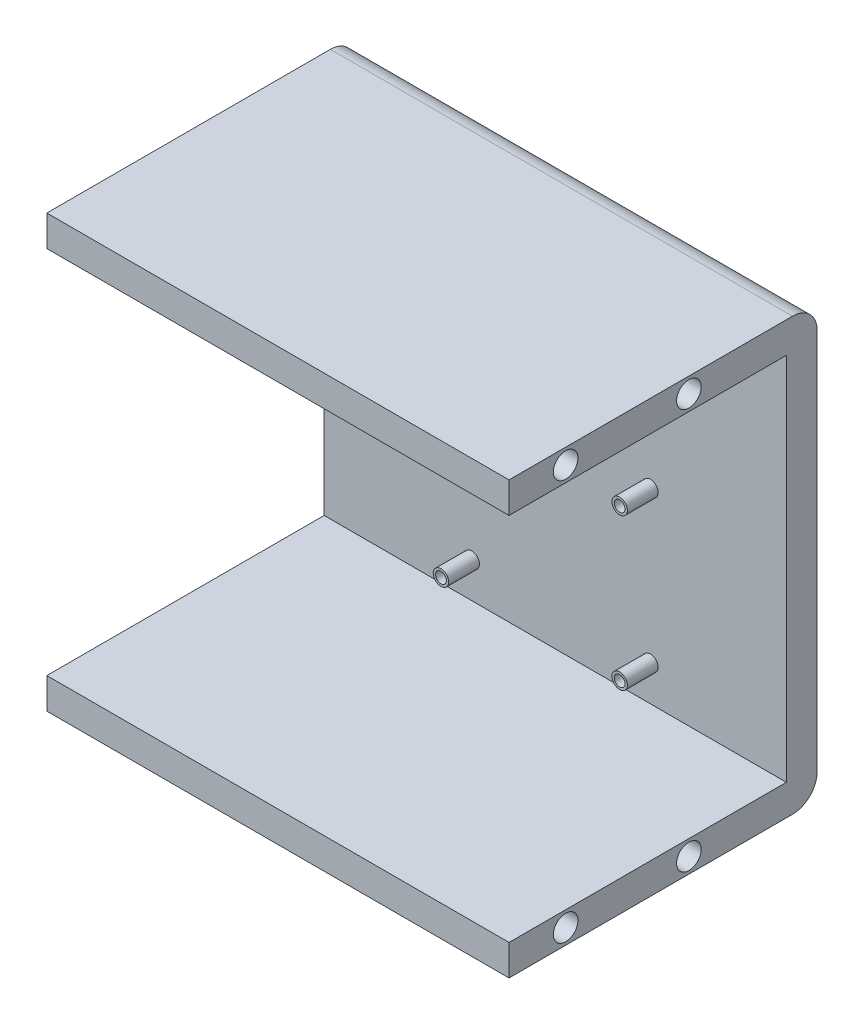
ISO-10303-21;
HEADER;
FILE_DESCRIPTION(('STEP AP214'),'2;1');
FILE_NAME('part.step','',(''),(''),'','','');
FILE_SCHEMA(('AUTOMOTIVE_DESIGN { 1 0 10303 214 1 1 1 1 }'));
ENDSEC;
DATA;
#1=APPLICATION_CONTEXT('core data for automotive mechanical design processes');
#2=APPLICATION_PROTOCOL_DEFINITION('international standard','automotive_design',2000,#1);
#3=PRODUCT_CONTEXT('',#1,'mechanical');
#4=PRODUCT('Part','Part','',(#3));
#5=PRODUCT_RELATED_PRODUCT_CATEGORY('part','',(#4));
#6=PRODUCT_DEFINITION_FORMATION('','',#4);
#7=PRODUCT_DEFINITION_CONTEXT('part definition',#1,'design');
#8=PRODUCT_DEFINITION('design','',#6,#7);
#9=PRODUCT_DEFINITION_SHAPE('','',#8);
#10=(LENGTH_UNIT() NAMED_UNIT(*) SI_UNIT(.MILLI.,.METRE.));
#11=(NAMED_UNIT(*) PLANE_ANGLE_UNIT() SI_UNIT($,.RADIAN.));
#12=(NAMED_UNIT(*) SI_UNIT($,.STERADIAN.) SOLID_ANGLE_UNIT());
#13=UNCERTAINTY_MEASURE_WITH_UNIT(LENGTH_MEASURE(1.E-05),#10,'distance_accuracy_value','');
#14=(GEOMETRIC_REPRESENTATION_CONTEXT(3) GLOBAL_UNCERTAINTY_ASSIGNED_CONTEXT((#13)) GLOBAL_UNIT_ASSIGNED_CONTEXT((#10,
#11,#12)) REPRESENTATION_CONTEXT('',''));
#15=CARTESIAN_POINT('',(0.,0.,0.));
#16=DIRECTION('',(0.,0.,1.));
#17=DIRECTION('',(1.,0.,0.));
#18=AXIS2_PLACEMENT_3D('',#15,#16,#17);
#19=CARTESIAN_POINT('',(150.,60.,10.));
#20=DIRECTION('',(-1.,0.,0.));
#21=DIRECTION('',(0.,0.,1.));
#22=AXIS2_PLACEMENT_3D('',#19,#20,#21);
#23=PLANE('',#22);
#24=CARTESIAN_POINT('',(150.,65.,41.6267321895131));
#25=DIRECTION('',(1.,0.,0.));
#26=DIRECTION('',(0.,0.,-1.));
#27=AXIS2_PLACEMENT_3D('',#24,#25,#26);
#28=CIRCLE('',#27,4.);
#29=CARTESIAN_POINT('',(150.,65.,37.6267321895131));
#30=VERTEX_POINT('',#29);
#31=EDGE_CURVE('E296',#30,#30,#28,.T.);
#32=ORIENTED_EDGE('',*,*,#31,.F.);
#33=EDGE_LOOP('',(#32));
#34=FACE_BOUND('',#33,.T.);
#35=CARTESIAN_POINT('',(150.,-65.,81.6267321895131));
#36=DIRECTION('',(1.,0.,0.));
#37=DIRECTION('',(0.,0.,-1.));
#38=AXIS2_PLACEMENT_3D('',#35,#36,#37);
#39=CIRCLE('',#38,4.00000000000001);
#40=CARTESIAN_POINT('',(150.,-65.,77.6267321895131));
#41=VERTEX_POINT('',#40);
#42=EDGE_CURVE('E289',#41,#41,#39,.T.);
#43=ORIENTED_EDGE('',*,*,#42,.F.);
#44=EDGE_LOOP('',(#43));
#45=FACE_BOUND('',#44,.T.);
#46=CARTESIAN_POINT('',(150.,-65.,41.6267321895131));
#47=DIRECTION('',(1.,0.,0.));
#48=DIRECTION('',(0.,0.,-1.));
#49=AXIS2_PLACEMENT_3D('',#46,#47,#48);
#50=CIRCLE('',#49,4.);
#51=CARTESIAN_POINT('',(150.,-65.,37.6267321895131));
#52=VERTEX_POINT('',#51);
#53=EDGE_CURVE('E301',#52,#52,#50,.T.);
#54=ORIENTED_EDGE('',*,*,#53,.F.);
#55=EDGE_LOOP('',(#54));
#56=FACE_BOUND('',#55,.T.);
#57=CARTESIAN_POINT('',(150.,65.,81.6267321895131));
#58=DIRECTION('',(1.,0.,0.));
#59=DIRECTION('',(0.,0.,-1.));
#60=AXIS2_PLACEMENT_3D('',#57,#58,#59);
#61=CIRCLE('',#60,4.00000000000001);
#62=CARTESIAN_POINT('',(150.,65.,77.6267321895131));
#63=VERTEX_POINT('',#62);
#64=EDGE_CURVE('E283',#63,#63,#61,.T.);
#65=ORIENTED_EDGE('',*,*,#64,.F.);
#66=EDGE_LOOP('',(#65));
#67=FACE_BOUND('',#66,.T.);
#68=DIRECTION('',(0.,1.,0.));
#69=VECTOR('',#68,1.);
#70=CARTESIAN_POINT('',(150.,60.,0.));
#71=LINE('',#70,#69);
#72=CARTESIAN_POINT('',(150.,-62.,0.));
#73=VERTEX_POINT('',#72);
#74=CARTESIAN_POINT('',(150.,62.,0.));
#75=VERTEX_POINT('',#74);
#76=EDGE_CURVE('E225',#73,#75,#71,.T.);
#77=ORIENTED_EDGE('',*,*,#76,.T.);
#78=CARTESIAN_POINT('',(150.,62.,8.));
#79=DIRECTION('',(-1.,0.,0.));
#80=DIRECTION('',(0.,0.,1.));
#81=AXIS2_PLACEMENT_3D('',#78,#79,#80);
#82=CIRCLE('',#81,8.);
#83=CARTESIAN_POINT('',(150.,70.,8.));
#84=VERTEX_POINT('',#83);
#85=EDGE_CURVE('E41',#75,#84,#82,.F.);
#86=ORIENTED_EDGE('',*,*,#85,.T.);
#87=DIRECTION('',(0.,0.,-1.));
#88=VECTOR('',#87,1.);
#89=CARTESIAN_POINT('',(150.,70.,0.));
#90=LINE('',#89,#88);
#91=CARTESIAN_POINT('',(150.,70.,100.));
#92=VERTEX_POINT('',#91);
#93=EDGE_CURVE('E131',#92,#84,#90,.T.);
#94=ORIENTED_EDGE('',*,*,#93,.F.);
#95=DIRECTION('',(0.,-1.,0.));
#96=VECTOR('',#95,1.);
#97=CARTESIAN_POINT('',(150.,70.,100.));
#98=LINE('',#97,#96);
#99=CARTESIAN_POINT('',(150.,60.,100.));
#100=VERTEX_POINT('',#99);
#101=EDGE_CURVE('E129',#92,#100,#98,.T.);
#102=ORIENTED_EDGE('',*,*,#101,.T.);
#103=DIRECTION('',(0.,0.,-1.));
#104=VECTOR('',#103,1.);
#105=CARTESIAN_POINT('',(150.,60.,0.));
#106=LINE('',#105,#104);
#107=CARTESIAN_POINT('',(150.,60.,10.));
#108=VERTEX_POINT('',#107);
#109=EDGE_CURVE('E122',#100,#108,#106,.T.);
#110=ORIENTED_EDGE('',*,*,#109,.T.);
#111=DIRECTION('',(0.,1.,0.));
#112=VECTOR('',#111,1.);
#113=CARTESIAN_POINT('',(150.,60.,10.));
#114=LINE('',#113,#112);
#115=CARTESIAN_POINT('',(150.,-60.,10.));
#116=VERTEX_POINT('',#115);
#117=EDGE_CURVE('E228',#116,#108,#114,.T.);
#118=ORIENTED_EDGE('',*,*,#117,.F.);
#119=DIRECTION('',(0.,0.,1.));
#120=VECTOR('',#119,1.);
#121=CARTESIAN_POINT('',(150.,-60.,0.));
#122=LINE('',#121,#120);
#123=CARTESIAN_POINT('',(150.,-60.,100.));
#124=VERTEX_POINT('',#123);
#125=EDGE_CURVE('E140',#116,#124,#122,.T.);
#126=ORIENTED_EDGE('',*,*,#125,.T.);
#127=DIRECTION('',(0.,1.,0.));
#128=VECTOR('',#127,1.);
#129=CARTESIAN_POINT('',(150.,-70.,100.));
#130=LINE('',#129,#128);
#131=CARTESIAN_POINT('',(150.,-70.,100.));
#132=VERTEX_POINT('',#131);
#133=EDGE_CURVE('E158',#132,#124,#130,.T.);
#134=ORIENTED_EDGE('',*,*,#133,.F.);
#135=DIRECTION('',(0.,0.,1.));
#136=VECTOR('',#135,1.);
#137=CARTESIAN_POINT('',(150.,-70.,0.));
#138=LINE('',#137,#136);
#139=CARTESIAN_POINT('',(150.,-70.,8.));
#140=VERTEX_POINT('',#139);
#141=EDGE_CURVE('E148',#140,#132,#138,.T.);
#142=ORIENTED_EDGE('',*,*,#141,.F.);
#143=CARTESIAN_POINT('',(150.,-62.,8.));
#144=DIRECTION('',(-1.,0.,0.));
#145=DIRECTION('',(0.,0.,1.));
#146=AXIS2_PLACEMENT_3D('',#143,#144,#145);
#147=CIRCLE('',#146,8.);
#148=EDGE_CURVE('E48',#140,#73,#147,.F.);
#149=ORIENTED_EDGE('',*,*,#148,.T.);
#150=EDGE_LOOP('',(#77,#86,#94,#102,#110,#118,#126,#134,#142,#149));
#151=FACE_BOUND('',#150,.T.);
#152=ADVANCED_FACE('F33',(#34,#45,#56,#67,#151),#23,.F.);
#153=CARTESIAN_POINT('',(0.,60.,10.));
#154=DIRECTION('',(1.,0.,0.));
#155=DIRECTION('',(0.,0.,-1.));
#156=AXIS2_PLACEMENT_3D('',#153,#154,#155);
#157=PLANE('',#156);
#158=CARTESIAN_POINT('',(0.,-30.,5.));
#159=DIRECTION('',(-1.,0.,0.));
#160=DIRECTION('',(0.,0.,1.));
#161=AXIS2_PLACEMENT_3D('',#158,#159,#160);
#162=CIRCLE('',#161,4.);
#163=CARTESIAN_POINT('',(0.,-30.,9.));
#164=VERTEX_POINT('',#163);
#165=EDGE_CURVE('E207',#164,#164,#162,.T.);
#166=ORIENTED_EDGE('',*,*,#165,.F.);
#167=EDGE_LOOP('',(#166));
#168=FACE_BOUND('',#167,.T.);
#169=CARTESIAN_POINT('',(0.,30.,5.00000000000001));
#170=DIRECTION('',(-1.,0.,0.));
#171=DIRECTION('',(0.,0.,1.));
#172=AXIS2_PLACEMENT_3D('',#169,#170,#171);
#173=CIRCLE('',#172,4.);
#174=CARTESIAN_POINT('',(0.,30.,9.00000000000001));
#175=VERTEX_POINT('',#174);
#176=EDGE_CURVE('E214',#175,#175,#173,.T.);
#177=ORIENTED_EDGE('',*,*,#176,.F.);
#178=EDGE_LOOP('',(#177));
#179=FACE_BOUND('',#178,.T.);
#180=CARTESIAN_POINT('',(0.,0.,5.00000000000001));
#181=DIRECTION('',(-1.,0.,0.));
#182=DIRECTION('',(0.,0.,1.));
#183=AXIS2_PLACEMENT_3D('',#180,#181,#182);
#184=CIRCLE('',#183,4.);
#185=CARTESIAN_POINT('',(0.,0.,9.00000000000001));
#186=VERTEX_POINT('',#185);
#187=EDGE_CURVE('E213',#186,#186,#184,.T.);
#188=ORIENTED_EDGE('',*,*,#187,.F.);
#189=EDGE_LOOP('',(#188));
#190=FACE_BOUND('',#189,.T.);
#191=DIRECTION('',(0.,0.,1.));
#192=VECTOR('',#191,1.);
#193=CARTESIAN_POINT('',(0.,70.,0.));
#194=LINE('',#193,#192);
#195=CARTESIAN_POINT('',(0.,70.,8.));
#196=VERTEX_POINT('',#195);
#197=CARTESIAN_POINT('',(0.,70.,100.));
#198=VERTEX_POINT('',#197);
#199=EDGE_CURVE('E112',#196,#198,#194,.T.);
#200=ORIENTED_EDGE('',*,*,#199,.F.);
#201=CARTESIAN_POINT('',(0.,62.,8.));
#202=DIRECTION('',(1.,0.,0.));
#203=DIRECTION('',(0.,0.,-1.));
#204=AXIS2_PLACEMENT_3D('',#201,#202,#203);
#205=CIRCLE('',#204,8.);
#206=CARTESIAN_POINT('',(0.,62.,0.));
#207=VERTEX_POINT('',#206);
#208=EDGE_CURVE('E247',#196,#207,#205,.F.);
#209=ORIENTED_EDGE('',*,*,#208,.T.);
#210=DIRECTION('',(0.,-1.,0.));
#211=VECTOR('',#210,1.);
#212=CARTESIAN_POINT('',(0.,60.,0.));
#213=LINE('',#212,#211);
#214=CARTESIAN_POINT('',(0.,-62.,0.));
#215=VERTEX_POINT('',#214);
#216=EDGE_CURVE('E232',#207,#215,#213,.T.);
#217=ORIENTED_EDGE('',*,*,#216,.T.);
#218=CARTESIAN_POINT('',(0.,-62.,8.));
#219=DIRECTION('',(1.,0.,0.));
#220=DIRECTION('',(0.,0.,-1.));
#221=AXIS2_PLACEMENT_3D('',#218,#219,#220);
#222=CIRCLE('',#221,8.);
#223=CARTESIAN_POINT('',(0.,-70.,8.));
#224=VERTEX_POINT('',#223);
#225=EDGE_CURVE('E245',#215,#224,#222,.F.);
#226=ORIENTED_EDGE('',*,*,#225,.T.);
#227=DIRECTION('',(0.,0.,-1.));
#228=VECTOR('',#227,1.);
#229=CARTESIAN_POINT('',(0.,-70.,0.));
#230=LINE('',#229,#228);
#231=CARTESIAN_POINT('',(0.,-70.,100.));
#232=VERTEX_POINT('',#231);
#233=EDGE_CURVE('E145',#232,#224,#230,.T.);
#234=ORIENTED_EDGE('',*,*,#233,.F.);
#235=DIRECTION('',(0.,1.,0.));
#236=VECTOR('',#235,1.);
#237=CARTESIAN_POINT('',(0.,-70.,100.));
#238=LINE('',#237,#236);
#239=CARTESIAN_POINT('',(0.,-60.,100.));
#240=VERTEX_POINT('',#239);
#241=EDGE_CURVE('E152',#232,#240,#238,.T.);
#242=ORIENTED_EDGE('',*,*,#241,.T.);
#243=DIRECTION('',(0.,0.,-1.));
#244=VECTOR('',#243,1.);
#245=CARTESIAN_POINT('',(0.,-60.,0.));
#246=LINE('',#245,#244);
#247=CARTESIAN_POINT('',(0.,-60.,10.));
#248=VERTEX_POINT('',#247);
#249=EDGE_CURVE('E137',#240,#248,#246,.T.);
#250=ORIENTED_EDGE('',*,*,#249,.T.);
#251=DIRECTION('',(0.,-1.,0.));
#252=VECTOR('',#251,1.);
#253=CARTESIAN_POINT('',(0.,60.,10.));
#254=LINE('',#253,#252);
#255=CARTESIAN_POINT('',(0.,60.,10.));
#256=VERTEX_POINT('',#255);
#257=EDGE_CURVE('E235',#256,#248,#254,.T.);
#258=ORIENTED_EDGE('',*,*,#257,.F.);
#259=DIRECTION('',(0.,0.,1.));
#260=VECTOR('',#259,1.);
#261=CARTESIAN_POINT('',(0.,60.,0.));
#262=LINE('',#261,#260);
#263=CARTESIAN_POINT('',(0.,60.,100.));
#264=VERTEX_POINT('',#263);
#265=EDGE_CURVE('E135',#256,#264,#262,.T.);
#266=ORIENTED_EDGE('',*,*,#265,.T.);
#267=DIRECTION('',(0.,-1.,0.));
#268=VECTOR('',#267,1.);
#269=CARTESIAN_POINT('',(0.,70.,100.));
#270=LINE('',#269,#268);
#271=EDGE_CURVE('E127',#198,#264,#270,.T.);
#272=ORIENTED_EDGE('',*,*,#271,.F.);
#273=EDGE_LOOP('',(#200,#209,#217,#226,#234,#242,#250,#258,#266,#272));
#274=FACE_BOUND('',#273,.T.);
#275=ADVANCED_FACE('F133',(#168,#179,#190,#274),#157,.F.);
#276=CARTESIAN_POINT('',(0.,0.,10.));
#277=DIRECTION('',(0.,0.,1.));
#278=DIRECTION('',(1.,0.,0.));
#279=AXIS2_PLACEMENT_3D('',#276,#277,#278);
#280=PLANE('',#279);
#281=CARTESIAN_POINT('',(47.9001152163457,-48.5,10.));
#282=DIRECTION('',(0.,0.,1.));
#283=DIRECTION('',(1.,0.,0.));
#284=AXIS2_PLACEMENT_3D('',#281,#282,#283);
#285=CIRCLE('',#284,2.50000000000001);
#286=CARTESIAN_POINT('',(50.4001152163457,-48.5,10.));
#287=VERTEX_POINT('',#286);
#288=EDGE_CURVE('E183',#287,#287,#285,.T.);
#289=ORIENTED_EDGE('',*,*,#288,.F.);
#290=EDGE_LOOP('',(#289));
#291=FACE_BOUND('',#290,.T.);
#292=CARTESIAN_POINT('',(105.9,-48.5,10.));
#293=DIRECTION('',(0.,0.,1.));
#294=DIRECTION('',(1.,0.,0.));
#295=AXIS2_PLACEMENT_3D('',#292,#293,#294);
#296=CIRCLE('',#295,2.5);
#297=CARTESIAN_POINT('',(108.4,-48.5,10.));
#298=VERTEX_POINT('',#297);
#299=EDGE_CURVE('E189',#298,#298,#296,.T.);
#300=ORIENTED_EDGE('',*,*,#299,.F.);
#301=EDGE_LOOP('',(#300));
#302=FACE_BOUND('',#301,.T.);
#303=CARTESIAN_POINT('',(105.9,0.615607451466016,10.));
#304=DIRECTION('',(0.,0.,1.));
#305=DIRECTION('',(1.,0.,0.));
#306=AXIS2_PLACEMENT_3D('',#303,#304,#305);
#307=CIRCLE('',#306,2.5);
#308=CARTESIAN_POINT('',(108.4,0.615607451466016,10.));
#309=VERTEX_POINT('',#308);
#310=EDGE_CURVE('E195',#309,#309,#307,.T.);
#311=ORIENTED_EDGE('',*,*,#310,.F.);
#312=EDGE_LOOP('',(#311));
#313=FACE_BOUND('',#312,.T.);
#314=CARTESIAN_POINT('',(47.9001152163457,0.499999999999987,10.));
#315=DIRECTION('',(0.,0.,1.));
#316=DIRECTION('',(1.,0.,0.));
#317=AXIS2_PLACEMENT_3D('',#314,#315,#316);
#318=CIRCLE('',#317,2.50000000000001);
#319=CARTESIAN_POINT('',(50.4001152163457,0.499999999999987,10.));
#320=VERTEX_POINT('',#319);
#321=EDGE_CURVE('E201',#320,#320,#318,.T.);
#322=ORIENTED_EDGE('',*,*,#321,.F.);
#323=EDGE_LOOP('',(#322));
#324=FACE_BOUND('',#323,.T.);
#325=ORIENTED_EDGE('',*,*,#117,.T.);
#326=DIRECTION('',(-1.,0.,0.));
#327=VECTOR('',#326,1.);
#328=CARTESIAN_POINT('',(0.,60.,10.));
#329=LINE('',#328,#327);
#330=EDGE_CURVE('E231',#108,#256,#329,.T.);
#331=ORIENTED_EDGE('',*,*,#330,.T.);
#332=ORIENTED_EDGE('',*,*,#257,.T.);
#333=DIRECTION('',(1.,0.,0.));
#334=VECTOR('',#333,1.);
#335=CARTESIAN_POINT('',(0.,-60.,10.));
#336=LINE('',#335,#334);
#337=EDGE_CURVE('E238',#248,#116,#336,.T.);
#338=ORIENTED_EDGE('',*,*,#337,.T.);
#339=EDGE_LOOP('',(#325,#331,#332,#338));
#340=FACE_BOUND('',#339,.T.);
#341=ADVANCED_FACE('F274',(#291,#302,#313,#324,#340),#280,.T.);
#342=CARTESIAN_POINT('',(0.,0.,0.));
#343=DIRECTION('',(0.,0.,1.));
#344=DIRECTION('',(1.,0.,0.));
#345=AXIS2_PLACEMENT_3D('',#342,#343,#344);
#346=PLANE('',#345);
#347=ORIENTED_EDGE('',*,*,#216,.F.);
#348=DIRECTION('',(-1.,0.,0.));
#349=VECTOR('',#348,1.);
#350=CARTESIAN_POINT('',(150.,62.,0.));
#351=LINE('',#350,#349);
#352=EDGE_CURVE('E55',#207,#75,#351,.F.);
#353=ORIENTED_EDGE('',*,*,#352,.T.);
#354=ORIENTED_EDGE('',*,*,#76,.F.);
#355=DIRECTION('',(1.,0.,0.));
#356=VECTOR('',#355,1.);
#357=CARTESIAN_POINT('',(0.,-62.,0.));
#358=LINE('',#357,#356);
#359=EDGE_CURVE('E249',#73,#215,#358,.F.);
#360=ORIENTED_EDGE('',*,*,#359,.T.);
#361=EDGE_LOOP('',(#347,#353,#354,#360));
#362=FACE_BOUND('',#361,.T.);
#363=ADVANCED_FACE('F258',(#362),#346,.F.);
#364=CARTESIAN_POINT('',(30.,0.,5.00000000000001));
#365=DIRECTION('',(-1.,0.,0.));
#366=DIRECTION('',(0.,0.,1.));
#367=AXIS2_PLACEMENT_3D('',#364,#365,#366);
#368=CYLINDRICAL_SURFACE('',#367,4.);
#369=CARTESIAN_POINT('',(30.,0.,5.00000000000001));
#370=DIRECTION('',(-1.,0.,0.));
#371=DIRECTION('',(0.,0.,1.));
#372=AXIS2_PLACEMENT_3D('',#369,#370,#371);
#373=CIRCLE('',#372,4.);
#374=CARTESIAN_POINT('',(30.,0.,9.00000000000001));
#375=VERTEX_POINT('',#374);
#376=EDGE_CURVE('E222',#375,#375,#373,.T.);
#377=ORIENTED_EDGE('',*,*,#376,.F.);
#378=EDGE_LOOP('',(#377));
#379=FACE_BOUND('',#378,.T.);
#380=ORIENTED_EDGE('',*,*,#187,.T.);
#381=EDGE_LOOP('',(#380));
#382=FACE_BOUND('',#381,.T.);
#383=ADVANCED_FACE('F430',(#379,#382),#368,.F.);
#384=CARTESIAN_POINT('',(30.,0.,5.00000000000001));
#385=DIRECTION('',(-1.,0.,0.));
#386=DIRECTION('',(0.,0.,1.));
#387=AXIS2_PLACEMENT_3D('',#384,#385,#386);
#388=PLANE('',#387);
#389=ORIENTED_EDGE('',*,*,#376,.T.);
#390=EDGE_LOOP('',(#389));
#391=FACE_BOUND('',#390,.T.);
#392=ADVANCED_FACE('F420',(#391),#388,.T.);
#393=CARTESIAN_POINT('',(30.,30.,5.00000000000001));
#394=DIRECTION('',(-1.,0.,0.));
#395=DIRECTION('',(0.,0.,1.));
#396=AXIS2_PLACEMENT_3D('',#393,#394,#395);
#397=CYLINDRICAL_SURFACE('',#396,4.);
#398=CARTESIAN_POINT('',(30.,30.,5.00000000000001));
#399=DIRECTION('',(-1.,0.,0.));
#400=DIRECTION('',(0.,0.,1.));
#401=AXIS2_PLACEMENT_3D('',#398,#399,#400);
#402=CIRCLE('',#401,4.);
#403=CARTESIAN_POINT('',(30.,30.,9.00000000000001));
#404=VERTEX_POINT('',#403);
#405=EDGE_CURVE('E210',#404,#404,#402,.T.);
#406=ORIENTED_EDGE('',*,*,#405,.F.);
#407=EDGE_LOOP('',(#406));
#408=FACE_BOUND('',#407,.T.);
#409=ORIENTED_EDGE('',*,*,#176,.T.);
#410=EDGE_LOOP('',(#409));
#411=FACE_BOUND('',#410,.T.);
#412=ADVANCED_FACE('F416',(#408,#411),#397,.F.);
#413=CARTESIAN_POINT('',(30.,30.,5.00000000000001));
#414=DIRECTION('',(-1.,0.,0.));
#415=DIRECTION('',(0.,0.,1.));
#416=AXIS2_PLACEMENT_3D('',#413,#414,#415);
#417=PLANE('',#416);
#418=ORIENTED_EDGE('',*,*,#405,.T.);
#419=EDGE_LOOP('',(#418));
#420=FACE_BOUND('',#419,.T.);
#421=ADVANCED_FACE('F412',(#420),#417,.T.);
#422=CARTESIAN_POINT('',(30.,-30.,5.));
#423=DIRECTION('',(-1.,0.,0.));
#424=DIRECTION('',(0.,0.,1.));
#425=AXIS2_PLACEMENT_3D('',#422,#423,#424);
#426=CYLINDRICAL_SURFACE('',#425,4.);
#427=CARTESIAN_POINT('',(30.,-30.,5.));
#428=DIRECTION('',(-1.,0.,0.));
#429=DIRECTION('',(0.,0.,1.));
#430=AXIS2_PLACEMENT_3D('',#427,#428,#429);
#431=CIRCLE('',#430,4.);
#432=CARTESIAN_POINT('',(30.,-30.,9.));
#433=VERTEX_POINT('',#432);
#434=EDGE_CURVE('E217',#433,#433,#431,.T.);
#435=ORIENTED_EDGE('',*,*,#434,.F.);
#436=EDGE_LOOP('',(#435));
#437=FACE_BOUND('',#436,.T.);
#438=ORIENTED_EDGE('',*,*,#165,.T.);
#439=EDGE_LOOP('',(#438));
#440=FACE_BOUND('',#439,.T.);
#441=ADVANCED_FACE('F415',(#437,#440),#426,.F.);
#442=CARTESIAN_POINT('',(30.,-30.,5.));
#443=DIRECTION('',(-1.,0.,0.));
#444=DIRECTION('',(0.,0.,1.));
#445=AXIS2_PLACEMENT_3D('',#442,#443,#444);
#446=PLANE('',#445);
#447=ORIENTED_EDGE('',*,*,#434,.T.);
#448=EDGE_LOOP('',(#447));
#449=FACE_BOUND('',#448,.T.);
#450=ADVANCED_FACE('F410',(#449),#446,.T.);
#451=CARTESIAN_POINT('',(47.9001152163457,0.499999999999987,20.));
#452=DIRECTION('',(0.,0.,-1.));
#453=DIRECTION('',(-1.,0.,0.));
#454=AXIS2_PLACEMENT_3D('',#451,#452,#453);
#455=CYLINDRICAL_SURFACE('',#454,2.50000000000001);
#456=CARTESIAN_POINT('',(47.9001152163457,0.499999999999987,20.));
#457=DIRECTION('',(0.,0.,1.));
#458=DIRECTION('',(1.,0.,0.));
#459=AXIS2_PLACEMENT_3D('',#456,#457,#458);
#460=CIRCLE('',#459,2.50000000000001);
#461=CARTESIAN_POINT('',(50.4001152163457,0.499999999999987,20.));
#462=VERTEX_POINT('',#461);
#463=EDGE_CURVE('E204',#462,#462,#460,.T.);
#464=ORIENTED_EDGE('',*,*,#463,.F.);
#465=EDGE_LOOP('',(#464));
#466=FACE_BOUND('',#465,.T.);
#467=ORIENTED_EDGE('',*,*,#321,.T.);
#468=EDGE_LOOP('',(#467));
#469=FACE_BOUND('',#468,.T.);
#470=ADVANCED_FACE('F406',(#466,#469),#455,.T.);
#471=CARTESIAN_POINT('',(47.9001152163457,0.499999999999987,20.));
#472=DIRECTION('',(0.,0.,1.));
#473=DIRECTION('',(1.,0.,0.));
#474=AXIS2_PLACEMENT_3D('',#471,#472,#473);
#475=PLANE('',#474);
#476=CARTESIAN_POINT('',(47.9001152163457,0.499999999999987,20.));
#477=DIRECTION('',(0.,0.,1.));
#478=DIRECTION('',(1.,0.,0.));
#479=AXIS2_PLACEMENT_3D('',#476,#477,#478);
#480=CIRCLE('',#479,1.75);
#481=CARTESIAN_POINT('',(49.6501152163457,0.499999999999987,20.));
#482=VERTEX_POINT('',#481);
#483=EDGE_CURVE('E165',#482,#482,#480,.T.);
#484=ORIENTED_EDGE('',*,*,#483,.F.);
#485=EDGE_LOOP('',(#484));
#486=FACE_BOUND('',#485,.T.);
#487=ORIENTED_EDGE('',*,*,#463,.T.);
#488=EDGE_LOOP('',(#487));
#489=FACE_BOUND('',#488,.T.);
#490=ADVANCED_FACE('F402',(#486,#489),#475,.T.);
#491=CARTESIAN_POINT('',(105.9,0.615607451466016,20.));
#492=DIRECTION('',(0.,0.,-1.));
#493=DIRECTION('',(-1.,0.,0.));
#494=AXIS2_PLACEMENT_3D('',#491,#492,#493);
#495=CYLINDRICAL_SURFACE('',#494,2.5);
#496=CARTESIAN_POINT('',(105.9,0.615607451466016,20.));
#497=DIRECTION('',(0.,0.,1.));
#498=DIRECTION('',(1.,0.,0.));
#499=AXIS2_PLACEMENT_3D('',#496,#497,#498);
#500=CIRCLE('',#499,2.5);
#501=CARTESIAN_POINT('',(108.4,0.615607451466016,20.));
#502=VERTEX_POINT('',#501);
#503=EDGE_CURVE('E198',#502,#502,#500,.T.);
#504=ORIENTED_EDGE('',*,*,#503,.F.);
#505=EDGE_LOOP('',(#504));
#506=FACE_BOUND('',#505,.T.);
#507=ORIENTED_EDGE('',*,*,#310,.T.);
#508=EDGE_LOOP('',(#507));
#509=FACE_BOUND('',#508,.T.);
#510=ADVANCED_FACE('F398',(#506,#509),#495,.T.);
#511=CARTESIAN_POINT('',(105.9,0.615607451466016,20.));
#512=DIRECTION('',(0.,0.,1.));
#513=DIRECTION('',(1.,0.,0.));
#514=AXIS2_PLACEMENT_3D('',#511,#512,#513);
#515=PLANE('',#514);
#516=CARTESIAN_POINT('',(105.9,0.615607451466016,20.));
#517=DIRECTION('',(0.,0.,1.));
#518=DIRECTION('',(1.,0.,0.));
#519=AXIS2_PLACEMENT_3D('',#516,#517,#518);
#520=CIRCLE('',#519,1.75);
#521=CARTESIAN_POINT('',(107.65,0.615607451466016,20.));
#522=VERTEX_POINT('',#521);
#523=EDGE_CURVE('E161',#522,#522,#520,.T.);
#524=ORIENTED_EDGE('',*,*,#523,.F.);
#525=EDGE_LOOP('',(#524));
#526=FACE_BOUND('',#525,.T.);
#527=ORIENTED_EDGE('',*,*,#503,.T.);
#528=EDGE_LOOP('',(#527));
#529=FACE_BOUND('',#528,.T.);
#530=ADVANCED_FACE('F394',(#526,#529),#515,.T.);
#531=CARTESIAN_POINT('',(105.9,-48.5,20.));
#532=DIRECTION('',(0.,0.,-1.));
#533=DIRECTION('',(-1.,0.,0.));
#534=AXIS2_PLACEMENT_3D('',#531,#532,#533);
#535=CYLINDRICAL_SURFACE('',#534,2.5);
#536=CARTESIAN_POINT('',(105.9,-48.5,20.));
#537=DIRECTION('',(0.,0.,1.));
#538=DIRECTION('',(1.,0.,0.));
#539=AXIS2_PLACEMENT_3D('',#536,#537,#538);
#540=CIRCLE('',#539,2.5);
#541=CARTESIAN_POINT('',(108.4,-48.5,20.));
#542=VERTEX_POINT('',#541);
#543=EDGE_CURVE('E192',#542,#542,#540,.T.);
#544=ORIENTED_EDGE('',*,*,#543,.F.);
#545=EDGE_LOOP('',(#544));
#546=FACE_BOUND('',#545,.T.);
#547=ORIENTED_EDGE('',*,*,#299,.T.);
#548=EDGE_LOOP('',(#547));
#549=FACE_BOUND('',#548,.T.);
#550=ADVANCED_FACE('F390',(#546,#549),#535,.T.);
#551=CARTESIAN_POINT('',(105.9,-48.5,20.));
#552=DIRECTION('',(0.,0.,1.));
#553=DIRECTION('',(1.,0.,0.));
#554=AXIS2_PLACEMENT_3D('',#551,#552,#553);
#555=PLANE('',#554);
#556=CARTESIAN_POINT('',(105.9,-48.5,20.));
#557=DIRECTION('',(0.,0.,1.));
#558=DIRECTION('',(1.,0.,0.));
#559=AXIS2_PLACEMENT_3D('',#556,#557,#558);
#560=CIRCLE('',#559,1.75);
#561=CARTESIAN_POINT('',(107.65,-48.5,20.));
#562=VERTEX_POINT('',#561);
#563=EDGE_CURVE('E172',#562,#562,#560,.T.);
#564=ORIENTED_EDGE('',*,*,#563,.F.);
#565=EDGE_LOOP('',(#564));
#566=FACE_BOUND('',#565,.T.);
#567=ORIENTED_EDGE('',*,*,#543,.T.);
#568=EDGE_LOOP('',(#567));
#569=FACE_BOUND('',#568,.T.);
#570=ADVANCED_FACE('F386',(#566,#569),#555,.T.);
#571=CARTESIAN_POINT('',(47.9001152163457,-48.5,20.));
#572=DIRECTION('',(0.,0.,-1.));
#573=DIRECTION('',(-1.,0.,0.));
#574=AXIS2_PLACEMENT_3D('',#571,#572,#573);
#575=CYLINDRICAL_SURFACE('',#574,2.50000000000001);
#576=CARTESIAN_POINT('',(47.9001152163457,-48.5,20.));
#577=DIRECTION('',(0.,0.,1.));
#578=DIRECTION('',(1.,0.,0.));
#579=AXIS2_PLACEMENT_3D('',#576,#577,#578);
#580=CIRCLE('',#579,2.50000000000001);
#581=CARTESIAN_POINT('',(50.4001152163457,-48.5,20.));
#582=VERTEX_POINT('',#581);
#583=EDGE_CURVE('E186',#582,#582,#580,.T.);
#584=ORIENTED_EDGE('',*,*,#583,.F.);
#585=EDGE_LOOP('',(#584));
#586=FACE_BOUND('',#585,.T.);
#587=ORIENTED_EDGE('',*,*,#288,.T.);
#588=EDGE_LOOP('',(#587));
#589=FACE_BOUND('',#588,.T.);
#590=ADVANCED_FACE('F382',(#586,#589),#575,.T.);
#591=CARTESIAN_POINT('',(47.9001152163457,-48.5,20.));
#592=DIRECTION('',(0.,0.,1.));
#593=DIRECTION('',(1.,0.,0.));
#594=AXIS2_PLACEMENT_3D('',#591,#592,#593);
#595=PLANE('',#594);
#596=CARTESIAN_POINT('',(47.9001152163457,-48.5,20.));
#597=DIRECTION('',(0.,0.,1.));
#598=DIRECTION('',(1.,0.,0.));
#599=AXIS2_PLACEMENT_3D('',#596,#597,#598);
#600=CIRCLE('',#599,1.75);
#601=CARTESIAN_POINT('',(49.6501152163457,-48.5,20.));
#602=VERTEX_POINT('',#601);
#603=EDGE_CURVE('E166',#602,#602,#600,.T.);
#604=ORIENTED_EDGE('',*,*,#603,.F.);
#605=EDGE_LOOP('',(#604));
#606=FACE_BOUND('',#605,.T.);
#607=ORIENTED_EDGE('',*,*,#583,.T.);
#608=EDGE_LOOP('',(#607));
#609=FACE_BOUND('',#608,.T.);
#610=ADVANCED_FACE('F356',(#606,#609),#595,.T.);
#611=CARTESIAN_POINT('',(47.9001152163457,-48.5,11.));
#612=DIRECTION('',(0.,0.,1.));
#613=DIRECTION('',(1.,0.,0.));
#614=AXIS2_PLACEMENT_3D('',#611,#612,#613);
#615=CYLINDRICAL_SURFACE('',#614,1.75);
#616=CARTESIAN_POINT('',(47.9001152163457,-48.5,11.));
#617=DIRECTION('',(0.,0.,1.));
#618=DIRECTION('',(1.,0.,0.));
#619=AXIS2_PLACEMENT_3D('',#616,#617,#618);
#620=CIRCLE('',#619,1.75);
#621=CARTESIAN_POINT('',(49.6501152163457,-48.5,11.));
#622=VERTEX_POINT('',#621);
#623=EDGE_CURVE('E162',#622,#622,#620,.T.);
#624=ORIENTED_EDGE('',*,*,#623,.F.);
#625=EDGE_LOOP('',(#624));
#626=FACE_BOUND('',#625,.T.);
#627=ORIENTED_EDGE('',*,*,#603,.T.);
#628=EDGE_LOOP('',(#627));
#629=FACE_BOUND('',#628,.T.);
#630=ADVANCED_FACE('F352',(#626,#629),#615,.F.);
#631=CARTESIAN_POINT('',(47.9001152163457,-48.5,11.));
#632=DIRECTION('',(0.,0.,1.));
#633=DIRECTION('',(1.,0.,0.));
#634=AXIS2_PLACEMENT_3D('',#631,#632,#633);
#635=PLANE('',#634);
#636=ORIENTED_EDGE('',*,*,#623,.T.);
#637=EDGE_LOOP('',(#636));
#638=FACE_BOUND('',#637,.T.);
#639=ADVANCED_FACE('F348',(#638),#635,.T.);
#640=CARTESIAN_POINT('',(105.9,-48.5,11.));
#641=DIRECTION('',(0.,0.,1.));
#642=DIRECTION('',(1.,0.,0.));
#643=AXIS2_PLACEMENT_3D('',#640,#641,#642);
#644=CYLINDRICAL_SURFACE('',#643,1.75);
#645=CARTESIAN_POINT('',(105.9,-48.5,11.));
#646=DIRECTION('',(0.,0.,1.));
#647=DIRECTION('',(1.,0.,0.));
#648=AXIS2_PLACEMENT_3D('',#645,#646,#647);
#649=CIRCLE('',#648,1.75);
#650=CARTESIAN_POINT('',(107.65,-48.5,11.));
#651=VERTEX_POINT('',#650);
#652=EDGE_CURVE('E169',#651,#651,#649,.T.);
#653=ORIENTED_EDGE('',*,*,#652,.F.);
#654=EDGE_LOOP('',(#653));
#655=FACE_BOUND('',#654,.T.);
#656=ORIENTED_EDGE('',*,*,#563,.T.);
#657=EDGE_LOOP('',(#656));
#658=FACE_BOUND('',#657,.T.);
#659=ADVANCED_FACE('F351',(#655,#658),#644,.F.);
#660=CARTESIAN_POINT('',(105.9,-48.5,11.));
#661=DIRECTION('',(0.,0.,1.));
#662=DIRECTION('',(1.,0.,0.));
#663=AXIS2_PLACEMENT_3D('',#660,#661,#662);
#664=PLANE('',#663);
#665=ORIENTED_EDGE('',*,*,#652,.T.);
#666=EDGE_LOOP('',(#665));
#667=FACE_BOUND('',#666,.T.);
#668=ADVANCED_FACE('F358',(#667),#664,.T.);
#669=CARTESIAN_POINT('',(105.9,0.615607451466016,11.));
#670=DIRECTION('',(0.,0.,1.));
#671=DIRECTION('',(1.,0.,0.));
#672=AXIS2_PLACEMENT_3D('',#669,#670,#671);
#673=CYLINDRICAL_SURFACE('',#672,1.75);
#674=CARTESIAN_POINT('',(105.9,0.615607451466016,11.));
#675=DIRECTION('',(0.,0.,1.));
#676=DIRECTION('',(1.,0.,0.));
#677=AXIS2_PLACEMENT_3D('',#674,#675,#676);
#678=CIRCLE('',#677,1.75);
#679=CARTESIAN_POINT('',(107.65,0.615607451466016,11.));
#680=VERTEX_POINT('',#679);
#681=EDGE_CURVE('E175',#680,#680,#678,.T.);
#682=ORIENTED_EDGE('',*,*,#681,.F.);
#683=EDGE_LOOP('',(#682));
#684=FACE_BOUND('',#683,.T.);
#685=ORIENTED_EDGE('',*,*,#523,.T.);
#686=EDGE_LOOP('',(#685));
#687=FACE_BOUND('',#686,.T.);
#688=ADVANCED_FACE('F361',(#684,#687),#673,.F.);
#689=CARTESIAN_POINT('',(105.9,0.615607451466016,11.));
#690=DIRECTION('',(0.,0.,1.));
#691=DIRECTION('',(1.,0.,0.));
#692=AXIS2_PLACEMENT_3D('',#689,#690,#691);
#693=PLANE('',#692);
#694=ORIENTED_EDGE('',*,*,#681,.T.);
#695=EDGE_LOOP('',(#694));
#696=FACE_BOUND('',#695,.T.);
#697=ADVANCED_FACE('F366',(#696),#693,.T.);
#698=CARTESIAN_POINT('',(47.9001152163457,0.499999999999987,11.));
#699=DIRECTION('',(0.,0.,1.));
#700=DIRECTION('',(1.,0.,0.));
#701=AXIS2_PLACEMENT_3D('',#698,#699,#700);
#702=CYLINDRICAL_SURFACE('',#701,1.75);
#703=CARTESIAN_POINT('',(47.9001152163457,0.499999999999987,11.));
#704=DIRECTION('',(0.,0.,1.));
#705=DIRECTION('',(1.,0.,0.));
#706=AXIS2_PLACEMENT_3D('',#703,#704,#705);
#707=CIRCLE('',#706,1.75);
#708=CARTESIAN_POINT('',(49.6501152163457,0.499999999999987,11.));
#709=VERTEX_POINT('',#708);
#710=EDGE_CURVE('E180',#709,#709,#707,.T.);
#711=ORIENTED_EDGE('',*,*,#710,.F.);
#712=EDGE_LOOP('',(#711));
#713=FACE_BOUND('',#712,.T.);
#714=ORIENTED_EDGE('',*,*,#483,.T.);
#715=EDGE_LOOP('',(#714));
#716=FACE_BOUND('',#715,.T.);
#717=ADVANCED_FACE('F369',(#713,#716),#702,.F.);
#718=CARTESIAN_POINT('',(47.9001152163457,0.499999999999987,11.));
#719=DIRECTION('',(0.,0.,1.));
#720=DIRECTION('',(1.,0.,0.));
#721=AXIS2_PLACEMENT_3D('',#718,#719,#720);
#722=PLANE('',#721);
#723=ORIENTED_EDGE('',*,*,#710,.T.);
#724=EDGE_LOOP('',(#723));
#725=FACE_BOUND('',#724,.T.);
#726=ADVANCED_FACE('F345',(#725),#722,.T.);
#727=CARTESIAN_POINT('',(0.,-60.,0.));
#728=DIRECTION('',(0.,1.,0.));
#729=DIRECTION('',(-1.,0.,0.));
#730=AXIS2_PLACEMENT_3D('',#727,#728,#729);
#731=PLANE('',#730);
#732=ORIENTED_EDGE('',*,*,#337,.F.);
#733=ORIENTED_EDGE('',*,*,#249,.F.);
#734=DIRECTION('',(-1.,0.,0.));
#735=VECTOR('',#734,1.);
#736=CARTESIAN_POINT('',(0.,-60.,100.));
#737=LINE('',#736,#735);
#738=EDGE_CURVE('E149',#124,#240,#737,.T.);
#739=ORIENTED_EDGE('',*,*,#738,.F.);
#740=ORIENTED_EDGE('',*,*,#125,.F.);
#741=EDGE_LOOP('',(#732,#733,#739,#740));
#742=FACE_BOUND('',#741,.T.);
#743=ADVANCED_FACE('F271',(#742),#731,.T.);
#744=CARTESIAN_POINT('',(0.,-70.,100.));
#745=DIRECTION('',(0.,0.,-1.));
#746=DIRECTION('',(-1.,0.,0.));
#747=AXIS2_PLACEMENT_3D('',#744,#745,#746);
#748=PLANE('',#747);
#749=ORIENTED_EDGE('',*,*,#738,.T.);
#750=ORIENTED_EDGE('',*,*,#241,.F.);
#751=DIRECTION('',(-1.,0.,0.));
#752=VECTOR('',#751,1.);
#753=CARTESIAN_POINT('',(0.,-70.,100.));
#754=LINE('',#753,#752);
#755=EDGE_CURVE('E151',#132,#232,#754,.T.);
#756=ORIENTED_EDGE('',*,*,#755,.F.);
#757=ORIENTED_EDGE('',*,*,#133,.T.);
#758=EDGE_LOOP('',(#749,#750,#756,#757));
#759=FACE_BOUND('',#758,.T.);
#760=ADVANCED_FACE('F267',(#759),#748,.F.);
#761=CARTESIAN_POINT('',(0.,-70.,0.));
#762=DIRECTION('',(0.,1.,0.));
#763=DIRECTION('',(-1.,0.,0.));
#764=AXIS2_PLACEMENT_3D('',#761,#762,#763);
#765=PLANE('',#764);
#766=ORIENTED_EDGE('',*,*,#233,.T.);
#767=DIRECTION('',(1.,0.,0.));
#768=VECTOR('',#767,1.);
#769=CARTESIAN_POINT('',(0.,-70.,8.));
#770=LINE('',#769,#768);
#771=EDGE_CURVE('E11',#224,#140,#770,.T.);
#772=ORIENTED_EDGE('',*,*,#771,.T.);
#773=ORIENTED_EDGE('',*,*,#141,.T.);
#774=ORIENTED_EDGE('',*,*,#755,.T.);
#775=EDGE_LOOP('',(#766,#772,#773,#774));
#776=FACE_BOUND('',#775,.T.);
#777=ADVANCED_FACE('F261',(#776),#765,.F.);
#778=CARTESIAN_POINT('',(0.,70.,100.));
#779=DIRECTION('',(0.,0.,-1.));
#780=DIRECTION('',(-1.,0.,0.));
#781=AXIS2_PLACEMENT_3D('',#778,#779,#780);
#782=PLANE('',#781);
#783=DIRECTION('',(1.,0.,0.));
#784=VECTOR('',#783,1.);
#785=CARTESIAN_POINT('',(0.,60.,100.));
#786=LINE('',#785,#784);
#787=EDGE_CURVE('E278',#264,#100,#786,.T.);
#788=ORIENTED_EDGE('',*,*,#787,.T.);
#789=ORIENTED_EDGE('',*,*,#101,.F.);
#790=DIRECTION('',(1.,0.,0.));
#791=VECTOR('',#790,1.);
#792=CARTESIAN_POINT('',(0.,70.,100.));
#793=LINE('',#792,#791);
#794=EDGE_CURVE('E116',#198,#92,#793,.T.);
#795=ORIENTED_EDGE('',*,*,#794,.F.);
#796=ORIENTED_EDGE('',*,*,#271,.T.);
#797=EDGE_LOOP('',(#788,#789,#795,#796));
#798=FACE_BOUND('',#797,.T.);
#799=ADVANCED_FACE('F126',(#798),#782,.F.);
#800=CARTESIAN_POINT('',(0.,70.,0.));
#801=DIRECTION('',(0.,1.,0.));
#802=DIRECTION('',(-1.,0.,0.));
#803=AXIS2_PLACEMENT_3D('',#800,#801,#802);
#804=PLANE('',#803);
#805=ORIENTED_EDGE('',*,*,#93,.T.);
#806=DIRECTION('',(-1.,0.,0.));
#807=VECTOR('',#806,1.);
#808=CARTESIAN_POINT('',(0.,70.,8.));
#809=LINE('',#808,#807);
#810=EDGE_CURVE('E119',#84,#196,#809,.T.);
#811=ORIENTED_EDGE('',*,*,#810,.T.);
#812=ORIENTED_EDGE('',*,*,#199,.T.);
#813=ORIENTED_EDGE('',*,*,#794,.T.);
#814=EDGE_LOOP('',(#805,#811,#812,#813));
#815=FACE_BOUND('',#814,.T.);
#816=ADVANCED_FACE('F115',(#815),#804,.T.);
#817=CARTESIAN_POINT('',(0.,60.,0.));
#818=DIRECTION('',(0.,1.,0.));
#819=DIRECTION('',(-1.,0.,0.));
#820=AXIS2_PLACEMENT_3D('',#817,#818,#819);
#821=PLANE('',#820);
#822=ORIENTED_EDGE('',*,*,#330,.F.);
#823=ORIENTED_EDGE('',*,*,#109,.F.);
#824=ORIENTED_EDGE('',*,*,#787,.F.);
#825=ORIENTED_EDGE('',*,*,#265,.F.);
#826=EDGE_LOOP('',(#822,#823,#824,#825));
#827=FACE_BOUND('',#826,.T.);
#828=ADVANCED_FACE('F324',(#827),#821,.F.);
#829=CARTESIAN_POINT('',(120.,65.,81.6267321895131));
#830=DIRECTION('',(1.,0.,0.));
#831=DIRECTION('',(0.,0.,-1.));
#832=AXIS2_PLACEMENT_3D('',#829,#830,#831);
#833=CYLINDRICAL_SURFACE('',#832,4.00000000000001);
#834=CARTESIAN_POINT('',(120.,65.,81.6267321895131));
#835=DIRECTION('',(1.,0.,0.));
#836=DIRECTION('',(0.,0.,-1.));
#837=AXIS2_PLACEMENT_3D('',#834,#835,#836);
#838=CIRCLE('',#837,4.00000000000001);
#839=CARTESIAN_POINT('',(120.,65.,77.6267321895131));
#840=VERTEX_POINT('',#839);
#841=EDGE_CURVE('E281',#840,#840,#838,.T.);
#842=ORIENTED_EDGE('',*,*,#841,.F.);
#843=EDGE_LOOP('',(#842));
#844=FACE_BOUND('',#843,.T.);
#845=ORIENTED_EDGE('',*,*,#64,.T.);
#846=EDGE_LOOP('',(#845));
#847=FACE_BOUND('',#846,.T.);
#848=ADVANCED_FACE('F322',(#844,#847),#833,.F.);
#849=CARTESIAN_POINT('',(120.,65.,81.6267321895131));
#850=DIRECTION('',(1.,0.,0.));
#851=DIRECTION('',(0.,0.,-1.));
#852=AXIS2_PLACEMENT_3D('',#849,#850,#851);
#853=PLANE('',#852);
#854=ORIENTED_EDGE('',*,*,#841,.T.);
#855=EDGE_LOOP('',(#854));
#856=FACE_BOUND('',#855,.T.);
#857=ADVANCED_FACE('F312',(#856),#853,.T.);
#858=CARTESIAN_POINT('',(120.,-65.,41.6267321895131));
#859=DIRECTION('',(1.,0.,0.));
#860=DIRECTION('',(0.,0.,-1.));
#861=AXIS2_PLACEMENT_3D('',#858,#859,#860);
#862=CYLINDRICAL_SURFACE('',#861,4.);
#863=CARTESIAN_POINT('',(120.,-65.,41.6267321895131));
#864=DIRECTION('',(1.,0.,0.));
#865=DIRECTION('',(0.,0.,-1.));
#866=AXIS2_PLACEMENT_3D('',#863,#864,#865);
#867=CIRCLE('',#866,4.);
#868=CARTESIAN_POINT('',(120.,-65.,37.6267321895131));
#869=VERTEX_POINT('',#868);
#870=EDGE_CURVE('E293',#869,#869,#867,.T.);
#871=ORIENTED_EDGE('',*,*,#870,.F.);
#872=EDGE_LOOP('',(#871));
#873=FACE_BOUND('',#872,.T.);
#874=ORIENTED_EDGE('',*,*,#53,.T.);
#875=EDGE_LOOP('',(#874));
#876=FACE_BOUND('',#875,.T.);
#877=ADVANCED_FACE('F309',(#873,#876),#862,.F.);
#878=CARTESIAN_POINT('',(120.,-65.,41.6267321895131));
#879=DIRECTION('',(1.,0.,0.));
#880=DIRECTION('',(0.,0.,-1.));
#881=AXIS2_PLACEMENT_3D('',#878,#879,#880);
#882=PLANE('',#881);
#883=ORIENTED_EDGE('',*,*,#870,.T.);
#884=EDGE_LOOP('',(#883));
#885=FACE_BOUND('',#884,.T.);
#886=ADVANCED_FACE('F307',(#885),#882,.T.);
#887=CARTESIAN_POINT('',(120.,-65.,81.6267321895131));
#888=DIRECTION('',(1.,0.,0.));
#889=DIRECTION('',(0.,0.,-1.));
#890=AXIS2_PLACEMENT_3D('',#887,#888,#889);
#891=CYLINDRICAL_SURFACE('',#890,4.00000000000001);
#892=CARTESIAN_POINT('',(120.,-65.,81.6267321895131));
#893=DIRECTION('',(1.,0.,0.));
#894=DIRECTION('',(0.,0.,-1.));
#895=AXIS2_PLACEMENT_3D('',#892,#893,#894);
#896=CIRCLE('',#895,4.00000000000001);
#897=CARTESIAN_POINT('',(120.,-65.,77.6267321895131));
#898=VERTEX_POINT('',#897);
#899=EDGE_CURVE('E292',#898,#898,#896,.T.);
#900=ORIENTED_EDGE('',*,*,#899,.F.);
#901=EDGE_LOOP('',(#900));
#902=FACE_BOUND('',#901,.T.);
#903=ORIENTED_EDGE('',*,*,#42,.T.);
#904=EDGE_LOOP('',(#903));
#905=FACE_BOUND('',#904,.T.);
#906=ADVANCED_FACE('F460',(#902,#905),#891,.F.);
#907=CARTESIAN_POINT('',(120.,-65.,81.6267321895131));
#908=DIRECTION('',(1.,0.,0.));
#909=DIRECTION('',(0.,0.,-1.));
#910=AXIS2_PLACEMENT_3D('',#907,#908,#909);
#911=PLANE('',#910);
#912=ORIENTED_EDGE('',*,*,#899,.T.);
#913=EDGE_LOOP('',(#912));
#914=FACE_BOUND('',#913,.T.);
#915=ADVANCED_FACE('F454',(#914),#911,.T.);
#916=CARTESIAN_POINT('',(120.,65.,41.6267321895131));
#917=DIRECTION('',(1.,0.,0.));
#918=DIRECTION('',(0.,0.,-1.));
#919=AXIS2_PLACEMENT_3D('',#916,#917,#918);
#920=CYLINDRICAL_SURFACE('',#919,4.);
#921=CARTESIAN_POINT('',(120.,65.,41.6267321895131));
#922=DIRECTION('',(1.,0.,0.));
#923=DIRECTION('',(0.,0.,-1.));
#924=AXIS2_PLACEMENT_3D('',#921,#922,#923);
#925=CIRCLE('',#924,4.);
#926=CARTESIAN_POINT('',(120.,65.,37.6267321895131));
#927=VERTEX_POINT('',#926);
#928=EDGE_CURVE('E286',#927,#927,#925,.T.);
#929=ORIENTED_EDGE('',*,*,#928,.F.);
#930=EDGE_LOOP('',(#929));
#931=FACE_BOUND('',#930,.T.);
#932=ORIENTED_EDGE('',*,*,#31,.T.);
#933=EDGE_LOOP('',(#932));
#934=FACE_BOUND('',#933,.T.);
#935=ADVANCED_FACE('F448',(#931,#934),#920,.F.);
#936=CARTESIAN_POINT('',(120.,65.,41.6267321895131));
#937=DIRECTION('',(1.,0.,0.));
#938=DIRECTION('',(0.,0.,-1.));
#939=AXIS2_PLACEMENT_3D('',#936,#937,#938);
#940=PLANE('',#939);
#941=ORIENTED_EDGE('',*,*,#928,.T.);
#942=EDGE_LOOP('',(#941));
#943=FACE_BOUND('',#942,.T.);
#944=ADVANCED_FACE('F443',(#943),#940,.T.);
#945=CARTESIAN_POINT('',(0.,62.,8.));
#946=DIRECTION('',(1.,0.,0.));
#947=DIRECTION('',(0.,1.,0.));
#948=AXIS2_PLACEMENT_3D('',#945,#946,#947);
#949=CYLINDRICAL_SURFACE('',#948,8.);
#950=ORIENTED_EDGE('',*,*,#85,.F.);
#951=ORIENTED_EDGE('',*,*,#352,.F.);
#952=ORIENTED_EDGE('',*,*,#208,.F.);
#953=ORIENTED_EDGE('',*,*,#810,.F.);
#954=EDGE_LOOP('',(#950,#951,#952,#953));
#955=FACE_BOUND('',#954,.T.);
#956=ADVANCED_FACE('F256',(#955),#949,.T.);
#957=CARTESIAN_POINT('',(0.,-62.,8.));
#958=DIRECTION('',(1.,0.,0.));
#959=DIRECTION('',(0.,1.,0.));
#960=AXIS2_PLACEMENT_3D('',#957,#958,#959);
#961=CYLINDRICAL_SURFACE('',#960,8.);
#962=ORIENTED_EDGE('',*,*,#225,.F.);
#963=ORIENTED_EDGE('',*,*,#359,.F.);
#964=ORIENTED_EDGE('',*,*,#148,.F.);
#965=ORIENTED_EDGE('',*,*,#771,.F.);
#966=EDGE_LOOP('',(#962,#963,#964,#965));
#967=FACE_BOUND('',#966,.T.);
#968=ADVANCED_FACE('F35',(#967),#961,.T.);
#969=CLOSED_SHELL('',(#152,#275,#341,#363,#383,#392,#412,#421,#441,#450,#470,#490,#510,#530,
#550,#570,#590,#610,#630,#639,#659,#668,#688,#697,#717,#726,#743,#760,#777,#799,#816,#828,#848,
#857,#877,#886,#906,#915,#935,#944,#956,#968));
#970=MANIFOLD_SOLID_BREP('B2',#969);
#971=ADVANCED_BREP_SHAPE_REPRESENTATION('',(#18,#970),#14);
#972=SHAPE_DEFINITION_REPRESENTATION(#9,#971);
ENDSEC;
END-ISO-10303-21;
